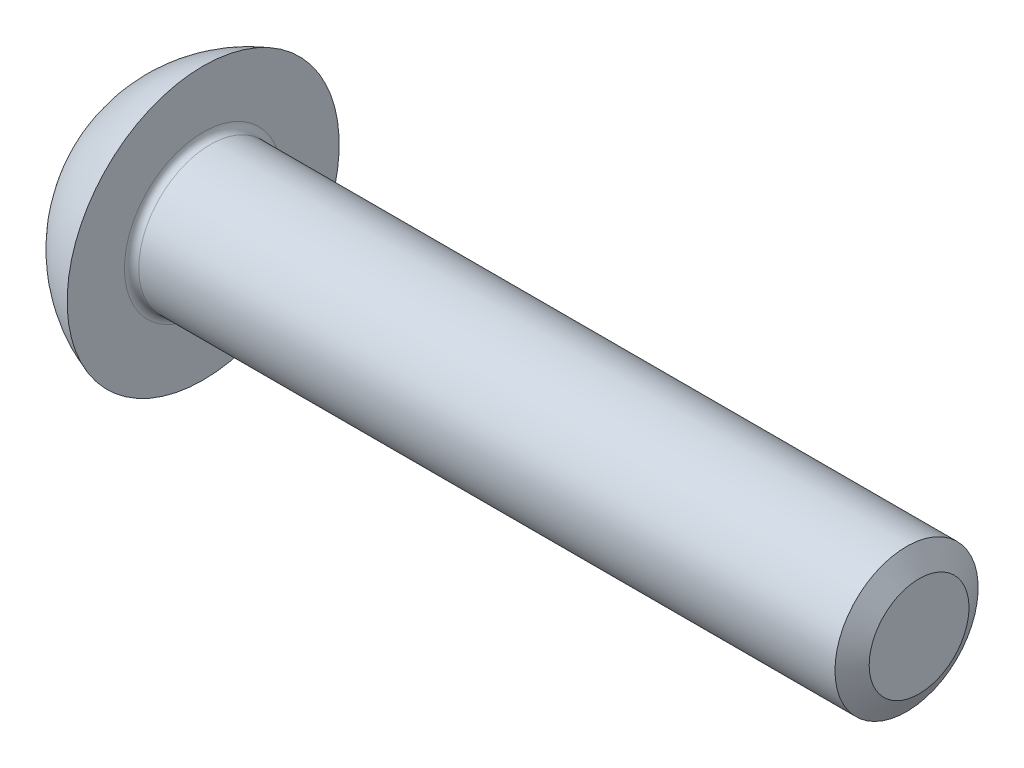
ISO-10303-21;
HEADER;
FILE_DESCRIPTION(('STEP AP214'),'2;1');
FILE_NAME('part.step','',(''),(''),'','','');
FILE_SCHEMA(('AUTOMOTIVE_DESIGN { 1 0 10303 214 1 1 1 1 }'));
ENDSEC;
DATA;
#1=APPLICATION_CONTEXT('core data for automotive mechanical design processes');
#2=APPLICATION_PROTOCOL_DEFINITION('international standard','automotive_design',2000,#1);
#3=PRODUCT_CONTEXT('',#1,'mechanical');
#4=PRODUCT('Part','Part','',(#3));
#5=PRODUCT_RELATED_PRODUCT_CATEGORY('part','',(#4));
#6=PRODUCT_DEFINITION_FORMATION('','',#4);
#7=PRODUCT_DEFINITION_CONTEXT('part definition',#1,'design');
#8=PRODUCT_DEFINITION('design','',#6,#7);
#9=PRODUCT_DEFINITION_SHAPE('','',#8);
#10=(LENGTH_UNIT() NAMED_UNIT(*) SI_UNIT(.MILLI.,.METRE.));
#11=(NAMED_UNIT(*) PLANE_ANGLE_UNIT() SI_UNIT($,.RADIAN.));
#12=(NAMED_UNIT(*) SI_UNIT($,.STERADIAN.) SOLID_ANGLE_UNIT());
#13=UNCERTAINTY_MEASURE_WITH_UNIT(LENGTH_MEASURE(1.E-05),#10,'distance_accuracy_value','');
#14=(GEOMETRIC_REPRESENTATION_CONTEXT(3) GLOBAL_UNCERTAINTY_ASSIGNED_CONTEXT((#13)) GLOBAL_UNIT_ASSIGNED_CONTEXT((#10,
#11,#12)) REPRESENTATION_CONTEXT('',''));
#15=CARTESIAN_POINT('',(0.,0.,0.));
#16=DIRECTION('',(0.,0.,1.));
#17=DIRECTION('',(1.,0.,0.));
#18=AXIS2_PLACEMENT_3D('',#15,#16,#17);
#19=CARTESIAN_POINT('',(-22.2,0.,0.));
#20=DIRECTION('',(-1.,0.,0.));
#21=DIRECTION('',(0.,0.,1.));
#22=AXIS2_PLACEMENT_3D('',#19,#20,#21);
#23=CYLINDRICAL_SURFACE('',#22,2.);
#24=CARTESIAN_POINT('',(-19.8,0.,0.));
#25=DIRECTION('',(-1.,0.,0.));
#26=DIRECTION('',(0.,0.,1.));
#27=AXIS2_PLACEMENT_3D('',#24,#25,#26);
#28=CIRCLE('',#27,2.);
#29=CARTESIAN_POINT('',(-19.8,0.,2.));
#30=VERTEX_POINT('',#29);
#31=EDGE_CURVE('E261',#30,#30,#28,.T.);
#32=ORIENTED_EDGE('',*,*,#31,.F.);
#33=EDGE_LOOP('',(#32));
#34=FACE_BOUND('',#33,.T.);
#35=CARTESIAN_POINT('',(-0.35,0.,0.));
#36=DIRECTION('',(-1.,0.,0.));
#37=DIRECTION('',(0.,0.,1.));
#38=AXIS2_PLACEMENT_3D('',#35,#36,#37);
#39=CIRCLE('',#38,2.);
#40=CARTESIAN_POINT('',(-0.35,0.,2.));
#41=VERTEX_POINT('',#40);
#42=EDGE_CURVE('E406',#41,#41,#39,.T.);
#43=ORIENTED_EDGE('',*,*,#42,.T.);
#44=EDGE_LOOP('',(#43));
#45=FACE_BOUND('',#44,.T.);
#46=ADVANCED_FACE('F40',(#34,#45),#23,.T.);
#47=CARTESIAN_POINT('',(-22.2,0.,0.));
#48=DIRECTION('',(1.,0.,0.));
#49=DIRECTION('',(0.,0.,-1.));
#50=AXIS2_PLACEMENT_3D('',#47,#48,#49);
#51=PLANE('',#50);
#52=CARTESIAN_POINT('',(-22.2,0.,0.));
#53=DIRECTION('',(-1.,0.,0.));
#54=DIRECTION('',(0.,0.,1.));
#55=AXIS2_PLACEMENT_3D('',#52,#53,#54);
#56=CIRCLE('',#55,2.);
#57=CARTESIAN_POINT('',(-22.2,2.,0.));
#58=VERTEX_POINT('',#57);
#59=EDGE_CURVE('E253',#58,#58,#56,.T.);
#60=ORIENTED_EDGE('',*,*,#59,.T.);
#61=EDGE_LOOP('',(#60));
#62=FACE_BOUND('',#61,.T.);
#63=CARTESIAN_POINT('',(-22.2,0.,0.));
#64=DIRECTION('',(1.,0.,0.));
#65=DIRECTION('',(0.,0.,-1.));
#66=AXIS2_PLACEMENT_3D('',#63,#64,#65);
#67=CIRCLE('',#66,1.44337567297406);
#68=CARTESIAN_POINT('',(-22.2,-0.721687836487032,-1.25));
#69=VERTEX_POINT('',#68);
#70=CARTESIAN_POINT('',(-22.2,-1.44337567297406,0.));
#71=VERTEX_POINT('',#70);
#72=EDGE_CURVE('E11',#69,#71,#67,.F.);
#73=ORIENTED_EDGE('',*,*,#72,.F.);
#74=CARTESIAN_POINT('',(-22.2,0.721687836487032,-1.25));
#75=VERTEX_POINT('',#74);
#76=EDGE_CURVE('E44',#75,#69,#67,.F.);
#77=ORIENTED_EDGE('',*,*,#76,.F.);
#78=CARTESIAN_POINT('',(-22.2,1.44337567297406,0.));
#79=VERTEX_POINT('',#78);
#80=EDGE_CURVE('E113',#79,#75,#67,.F.);
#81=ORIENTED_EDGE('',*,*,#80,.F.);
#82=CARTESIAN_POINT('',(-22.2,0.721687836487032,1.25));
#83=VERTEX_POINT('',#82);
#84=EDGE_CURVE('E326',#83,#79,#67,.F.);
#85=ORIENTED_EDGE('',*,*,#84,.F.);
#86=CARTESIAN_POINT('',(-22.2,-0.72168783648703,1.25));
#87=VERTEX_POINT('',#86);
#88=EDGE_CURVE('E49',#87,#83,#67,.F.);
#89=ORIENTED_EDGE('',*,*,#88,.F.);
#90=CARTESIAN_POINT('',(-22.2,0.,0.));
#91=DIRECTION('',(-1.,0.,0.));
#92=DIRECTION('',(0.,-1.,0.));
#93=AXIS2_PLACEMENT_3D('',#90,#91,#92);
#94=CIRCLE('',#93,1.44337567297406);
#95=EDGE_CURVE('E116',#71,#87,#94,.T.);
#96=ORIENTED_EDGE('',*,*,#95,.F.);
#97=EDGE_LOOP('',(#73,#77,#81,#85,#89,#96));
#98=FACE_BOUND('',#97,.T.);
#99=ADVANCED_FACE('F42',(#62,#98),#51,.F.);
#100=CARTESIAN_POINT('',(-18.7272727272727,0.,0.));
#101=DIRECTION('',(-1.,0.,0.));
#102=DIRECTION('',(0.,1.,0.));
#103=AXIS2_PLACEMENT_3D('',#100,#101,#102);
#104=SPHERICAL_SURFACE('',#103,4.00747235932374);
#105=CARTESIAN_POINT('',(-20.,0.,0.));
#106=DIRECTION('',(-1.,0.,0.));
#107=DIRECTION('',(0.,0.,1.));
#108=AXIS2_PLACEMENT_3D('',#105,#106,#107);
#109=CIRCLE('',#108,3.8);
#110=CARTESIAN_POINT('',(-20.,3.8,0.));
#111=VERTEX_POINT('',#110);
#112=EDGE_CURVE('E256',#111,#111,#109,.T.);
#113=CARTESIAN_POINT('',(-22.2,2.,0.));
#114=CARTESIAN_POINT('',(-22.1848940441993,2.0262295590073,0.));
#115=CARTESIAN_POINT('',(-22.1694908144314,2.05228791024858,0.));
#116=CARTESIAN_POINT('',(-22.1380979525594,2.10404896261472,0.));
#117=CARTESIAN_POINT('',(-22.1221083204554,2.12975166373959,0.));
#118=CARTESIAN_POINT('',(-22.0895507995097,2.18078818128854,0.));
#119=CARTESIAN_POINT('',(-22.072982910668,2.20612199771262,0.));
#120=CARTESIAN_POINT('',(-22.0392773993975,2.25640774959029,0.));
#121=CARTESIAN_POINT('',(-22.0221397769687,2.28135968504386,0.));
#122=CARTESIAN_POINT('',(-21.9873035925655,2.33086886166223,0.));
#123=CARTESIAN_POINT('',(-21.9696050305911,2.35542610282703,0.));
#124=CARTESIAN_POINT('',(-21.9336560549214,2.40413328370188,0.));
#125=CARTESIAN_POINT('',(-21.9154056412261,2.42828322341193,0.));
#126=CARTESIAN_POINT('',(-21.8783623317131,2.47616340238235,0.));
#127=CARTESIAN_POINT('',(-21.8595694358953,2.49989364164271,0.));
#128=CARTESIAN_POINT('',(-21.8214508106667,2.54692223644896,0.));
#129=CARTESIAN_POINT('',(-21.8021250812559,2.57022059199485,0.));
#130=CARTESIAN_POINT('',(-21.7629507108208,2.61637345777279,0.));
#131=CARTESIAN_POINT('',(-21.7431020697966,2.63922796800484,0.));
#132=CARTESIAN_POINT('',(-21.7028920666117,2.68448140944799,0.));
#133=CARTESIAN_POINT('',(-21.682530704451,2.70688034065911,0.));
#134=CARTESIAN_POINT('',(-21.6413057126977,2.75121112424682,0.));
#135=CARTESIAN_POINT('',(-21.6204420831052,2.77314297662341,0.));
#136=CARTESIAN_POINT('',(-21.5782232680636,2.81652834253228,0.));
#137=CARTESIAN_POINT('',(-21.5568680826145,2.83798185606455,0.));
#138=CARTESIAN_POINT('',(-21.5136771198039,2.88039952985806,0.));
#139=CARTESIAN_POINT('',(-21.4918413424423,2.90136369011931,0.));
#140=CARTESIAN_POINT('',(-21.447700406491,2.94279189418253,0.));
#141=CARTESIAN_POINT('',(-21.4253952479013,2.96325593798452,0.));
#142=CARTESIAN_POINT('',(-21.3803270011625,3.00367340270524,0.));
#143=CARTESIAN_POINT('',(-21.3575639130134,3.02362682362399,0.));
#144=CARTESIAN_POINT('',(-21.3115914939299,3.06301279831263,0.));
#145=CARTESIAN_POINT('',(-21.2883821629955,3.08244535208254,0.));
#146=CARTESIAN_POINT('',(-21.2415291742204,3.12077961562579,0.));
#147=CARTESIAN_POINT('',(-21.2178855163797,3.13968132539914,0.));
#148=CARTESIAN_POINT('',(-21.1701760126585,3.17694419664163,0.));
#149=CARTESIAN_POINT('',(-21.1461101667779,3.19530535811077,0.));
#150=CARTESIAN_POINT('',(-21.0975686425984,3.23147770595957,0.));
#151=CARTESIAN_POINT('',(-21.0730929642995,3.24928889233922,0.));
#152=CARTESIAN_POINT('',(-21.0237443413165,3.2843521455859,0.));
#153=CARTESIAN_POINT('',(-20.9988713966324,3.30160421245294,0.));
#154=CARTESIAN_POINT('',(-20.9487410108723,3.3355403693082,0.));
#155=CARTESIAN_POINT('',(-20.9234835697963,3.35222445929642,0.));
#156=CARTESIAN_POINT('',(-20.8725971586496,3.38501609663248,0.));
#157=CARTESIAN_POINT('',(-20.846968188579,3.40112364398032,0.));
#158=CARTESIAN_POINT('',(-20.7953518775865,3.43275392627554,0.));
#159=CARTESIAN_POINT('',(-20.7693645366645,3.44827666122294,0.));
#160=CARTESIAN_POINT('',(-20.7170448261044,3.47872934920754,0.));
#161=CARTESIAN_POINT('',(-20.6907124564662,3.49365930224475,0.));
#162=CARTESIAN_POINT('',(-20.6377162077463,3.52291876123,0.));
#163=CARTESIAN_POINT('',(-20.6110523286645,3.53724826717803,0.));
#164=CARTESIAN_POINT('',(-20.5574067505418,3.56529947511373,0.));
#165=CARTESIAN_POINT('',(-20.5304250515009,3.57902117710138,0.));
#166=CARTESIAN_POINT('',(-20.4761576860719,3.60584973217452,0.));
#167=CARTESIAN_POINT('',(-20.4488720196837,3.61895658526,0.));
#168=CARTESIAN_POINT('',(-20.3940107283966,3.6445487137135,0.));
#169=CARTESIAN_POINT('',(-20.3664351034975,3.65703398908152,0.));
#170=CARTESIAN_POINT('',(-20.3110080522769,3.6813765507008,0.));
#171=CARTESIAN_POINT('',(-20.2831566259553,3.69323383695206,0.));
#172=CARTESIAN_POINT('',(-20.2271922728732,3.71631433772655,0.));
#173=CARTESIAN_POINT('',(-20.1990793461126,3.72753755224977,0.));
#174=CARTESIAN_POINT('',(-20.1426064188229,3.74934412871163,0.));
#175=CARTESIAN_POINT('',(-20.1142464182937,3.75992749065027,0.));
#176=CARTESIAN_POINT('',(-20.0572939289701,3.78044899835327,0.));
#177=CARTESIAN_POINT('',(-20.0287014401756,3.79038714411763,0.));
#178=CARTESIAN_POINT('',(-20.,3.8,0.));
#179=B_SPLINE_CURVE_WITH_KNOTS('',3,(#113,#114,#115,#116,#117,#118,#119,#120,#121,#122,#123,
#124,#125,#126,#127,#128,#129,#130,#131,#132,#133,#134,#135,#136,#137,#138,#139,#140,#141,#142,
#143,#144,#145,#146,#147,#148,#149,#150,#151,#152,#153,#154,#155,#156,#157,#158,#159,#160,#161,
#162,#163,#164,#165,#166,#167,#168,#169,#170,#171,#172,#173,#174,#175,#176,#177,#178),
.UNSPECIFIED.,.F.,.F.,(4,2,2,2,2,2,2,2,2,2,2,2,2,2,2,2,2,2,2,2,2,2,2,2,2,2,2,2,2,2,2,2,4),(0.,
0.0908034330338798,0.18160686606776,0.272410299101639,0.363213732135519,0.454017165169397,
0.544820598203278,0.635624031237158,0.726427464271037,0.817230897304917,0.908034330338796,
0.998837763372674,1.08964119640656,1.18044462944044,1.27124806247431,1.36205149550819,
1.45285492854207,1.54365836157595,1.63446179460983,1.72526522764371,1.81606866067759,
1.90687209371147,1.99767552674535,2.08847895977923,2.17928239281311,2.27008582584699,
2.36088925888087,2.45169269191475,2.54249612494863,2.63329955798251,2.72410299101638,
2.81490642405026,2.90570985708415),.UNSPECIFIED.);
#180=EDGE_CURVE('BSEAM242',#58,#111,#179,.T.);
#181=ORIENTED_EDGE('',*,*,#59,.F.);
#182=ORIENTED_EDGE('',*,*,#112,.T.);
#183=ORIENTED_EDGE('',*,*,#180,.T.);
#184=ORIENTED_EDGE('',*,*,#180,.F.);
#185=EDGE_LOOP('',(#181,#183,#182,#184));
#186=FACE_BOUND('',#185,.T.);
#187=ADVANCED_FACE('F242',(#186),#104,.T.);
#188=CARTESIAN_POINT('',(-20.,2.2,0.));
#189=DIRECTION('',(-1.,0.,0.));
#190=DIRECTION('',(0.,0.,1.));
#191=AXIS2_PLACEMENT_3D('',#188,#189,#190);
#192=PLANE('',#191);
#193=ORIENTED_EDGE('',*,*,#112,.F.);
#194=EDGE_LOOP('',(#193));
#195=FACE_BOUND('',#194,.T.);
#196=CARTESIAN_POINT('',(-20.,0.,0.));
#197=DIRECTION('',(-1.,0.,0.));
#198=DIRECTION('',(0.,0.,1.));
#199=AXIS2_PLACEMENT_3D('',#196,#197,#198);
#200=CIRCLE('',#199,2.2);
#201=CARTESIAN_POINT('',(-20.,0.,2.2));
#202=VERTEX_POINT('',#201);
#203=EDGE_CURVE('E257',#202,#202,#200,.T.);
#204=ORIENTED_EDGE('',*,*,#203,.T.);
#205=EDGE_LOOP('',(#204));
#206=FACE_BOUND('',#205,.T.);
#207=ADVANCED_FACE('F239',(#195,#206),#192,.F.);
#208=CARTESIAN_POINT('',(-19.8,0.,0.));
#209=DIRECTION('',(-1.,0.,0.));
#210=DIRECTION('',(0.,0.,1.));
#211=AXIS2_PLACEMENT_3D('',#208,#209,#210);
#212=TOROIDAL_SURFACE('',#211,2.2,0.199999999999998);
#213=ORIENTED_EDGE('',*,*,#203,.F.);
#214=EDGE_LOOP('',(#213));
#215=FACE_BOUND('',#214,.T.);
#216=ORIENTED_EDGE('',*,*,#31,.T.);
#217=EDGE_LOOP('',(#216));
#218=FACE_BOUND('',#217,.T.);
#219=ADVANCED_FACE('F236',(#215,#218),#212,.F.);
#220=CARTESIAN_POINT('',(-21.83,0.,0.));
#221=DIRECTION('',(-1.,0.,0.));
#222=DIRECTION('',(0.,-1.,0.));
#223=AXIS2_PLACEMENT_3D('',#220,#221,#222);
#224=CONICAL_SURFACE('',#223,0.,1.31985626102756);
#225=CARTESIAN_POINT('',(-22.4099346759325,-1.88564456107599,-1.25));
#226=CARTESIAN_POINT('',(-22.3978717207476,-1.82917708741649,-1.25));
#227=CARTESIAN_POINT('',(-22.3859628503841,-1.77267667257229,-1.25));
#228=CARTESIAN_POINT('',(-22.3625309817374,-1.6595935375387,-1.25));
#229=CARTESIAN_POINT('',(-22.3510079994509,-1.60301081403846,-1.25));
#230=CARTESIAN_POINT('',(-22.3171150455956,-1.43301680255399,-1.25));
#231=CARTESIAN_POINT('',(-22.2954436732229,-1.31946408423816,-1.25));
#232=CARTESIAN_POINT('',(-22.2550957638519,-1.09274070822473,-1.25));
#233=CARTESIAN_POINT('',(-22.2363969731626,-0.979574090908787,-1.25));
#234=CARTESIAN_POINT('',(-22.2032623365578,-0.752620098767594,-1.25));
#235=CARTESIAN_POINT('',(-22.188825705465,-0.638832842215424,-1.25));
#236=CARTESIAN_POINT('',(-22.1660896767959,-0.409425109570646,-1.25));
#237=CARTESIAN_POINT('',(-22.1578544497063,-0.293797778292056,-1.25));
#238=CARTESIAN_POINT('',(-22.1515679025376,-0.120164512871692,-1.25));
#239=CARTESIAN_POINT('',(-22.150483164521,-0.0622627928697112,-1.25));
#240=CARTESIAN_POINT('',(-22.1503795328621,0.053542564363427,-1.25));
#241=CARTESIAN_POINT('',(-22.1513606413601,0.111446201596509,-1.25));
#242=CARTESIAN_POINT('',(-22.1573598650309,0.285474295611225,-1.25));
#243=CARTESIAN_POINT('',(-22.1654487463646,0.401498867331893,-1.25));
#244=CARTESIAN_POINT('',(-22.1881044285101,0.632939913567418,-1.25));
#245=CARTESIAN_POINT('',(-22.2026754362751,0.74835594383121,-1.25));
#246=CARTESIAN_POINT('',(-22.2365518645336,0.98087854833956,-1.25));
#247=CARTESIAN_POINT('',(-22.2559479393881,1.09797147869704,-1.25));
#248=CARTESIAN_POINT('',(-22.297694705209,1.33163516353435,-1.25));
#249=CARTESIAN_POINT('',(-22.3200458280349,1.44820583911091,-1.25));
#250=CARTESIAN_POINT('',(-22.3666691464558,1.68099121637415,-1.25));
#251=CARTESIAN_POINT('',(-22.3909418646374,1.7972058122361,-1.25));
#252=CARTESIAN_POINT('',(-22.4407644332086,2.02936144854685,-1.25));
#253=CARTESIAN_POINT('',(-22.4663143094331,2.14530248341221,-1.25));
#254=CARTESIAN_POINT('',(-22.518006571917,2.37571314631909,-1.25));
#255=CARTESIAN_POINT('',(-22.5441393559518,2.49018493743662,-1.25));
#256=CARTESIAN_POINT('',(-22.5970181249123,2.71898894131965,-1.25));
#257=CARTESIAN_POINT('',(-22.6237641225282,2.83332115114489,-1.25));
#258=CARTESIAN_POINT('',(-22.6776683130688,3.06173187864781,-1.25));
#259=CARTESIAN_POINT('',(-22.7048259274931,3.17581053313172,-1.25));
#260=CARTESIAN_POINT('',(-22.7594820608418,3.40388218743046,-1.25));
#261=CARTESIAN_POINT('',(-22.7869805683896,3.51787518996982,-1.25));
#262=CARTESIAN_POINT('',(-22.8145979060137,3.63183906574752,-1.25));
#263=B_SPLINE_CURVE_WITH_KNOTS('',3,(#225,#226,#227,#228,#229,#230,#231,#232,#233,#234,#235,
#236,#237,#238,#239,#240,#241,#242,#243,#244,#245,#246,#247,#248,#249,#250,#251,#252,#253,#254,
#255,#256,#257,#258,#259,#260,#261,#262),.UNSPECIFIED.,.F.,.F.,(4,2,2,2,2,2,2,2,2,2,2,2,2,2,2,2,
2,2,4),(0.,0.173224298995285,0.346455770019721,0.693239171189209,1.03728991141695,
1.38127723083866,1.72877689604066,1.90247833739643,2.07617995870962,2.42483219738434,
2.77371104508348,3.12971850144864,3.48577804345033,3.84193475233926,4.19809866864176,
4.55034691705481,4.90260246171337,5.25440194240086,5.60618971383705),.UNSPECIFIED.);
#264=EDGE_CURVE('E104',#69,#75,#263,.T.);
#265=ORIENTED_EDGE('',*,*,#264,.T.);
#266=ORIENTED_EDGE('',*,*,#76,.T.);
#267=EDGE_LOOP('',(#265,#266));
#268=FACE_BOUND('',#267,.T.);
#269=ADVANCED_FACE('F108',(#268),#224,.F.);
#270=CARTESIAN_POINT('',(-22.2000296035517,0.721572366433194,-1.2502));
#271=CARTESIAN_POINT('',(-22.1923376245114,0.751560236122211,-1.19825948608787));
#272=CARTESIAN_POINT('',(-22.1853558988612,0.781597955311093,-1.14623263030924));
#273=CARTESIAN_POINT('',(-22.1730912390252,0.841770545746215,-1.04201064645257));
#274=CARTESIAN_POINT('',(-22.1678089341386,0.871905448817342,-0.989815463252219));
#275=CARTESIAN_POINT('',(-22.1592477971586,0.932104975245319,-0.885546824887377));
#276=CARTESIAN_POINT('',(-22.1559596086559,0.96216925702196,-0.833473961357168));
#277=CARTESIAN_POINT('',(-22.1515506008694,1.0223329488635,-0.729267390316703));
#278=CARTESIAN_POINT('',(-22.1504293994002,1.05243235179702,-0.677133695158352));
#279=CARTESIAN_POINT('',(-22.1504293994002,1.11263115766407,-0.572866304841649));
#280=CARTESIAN_POINT('',(-22.1515506008694,1.1427305605976,-0.520732609683297));
#281=CARTESIAN_POINT('',(-22.1559596086559,1.20289425243914,-0.416526038642832));
#282=CARTESIAN_POINT('',(-22.1592477971586,1.23295853421578,-0.364453175112624));
#283=CARTESIAN_POINT('',(-22.1678089341386,1.29315806064375,-0.260184536747781));
#284=CARTESIAN_POINT('',(-22.1730912390252,1.32329296371488,-0.207989353547427));
#285=CARTESIAN_POINT('',(-22.1853558988612,1.38346555415,-0.103767369690763));
#286=CARTESIAN_POINT('',(-22.1923376245114,1.41350327333889,-0.0517405139121318));
#287=CARTESIAN_POINT('',(-22.2000296035517,1.4434911430279,0.000199999999999577));
#288=B_SPLINE_CURVE_WITH_KNOTS('',3,(#270,#271,#272,#273,#274,#275,#276,#277,#278,#279,#280,
#281,#282,#283,#284,#285,#286,#287),.UNSPECIFIED.,.F.,.F.,(4,2,2,2,2,2,2,2,4),(0.,
0.181409592460797,0.362886284169927,0.543504761741732,0.724091381228727,0.904678000715721,
1.08529647828753,1.26677316999666,1.44818276245745),.UNSPECIFIED.);
#289=EDGE_CURVE('E132',#75,#79,#288,.T.);
#290=ORIENTED_EDGE('',*,*,#289,.T.);
#291=ORIENTED_EDGE('',*,*,#80,.T.);
#292=EDGE_LOOP('',(#290,#291));
#293=FACE_BOUND('',#292,.T.);
#294=ADVANCED_FACE('F160',(#293),#224,.F.);
#295=CARTESIAN_POINT('',(-22.2000296035517,1.4434911430279,-0.000200000000000031));
#296=CARTESIAN_POINT('',(-22.1923376245114,1.41350327333889,0.0517405139121313));
#297=CARTESIAN_POINT('',(-22.1853558988612,1.38346555415,0.103767369690762));
#298=CARTESIAN_POINT('',(-22.1730912390252,1.32329296371488,0.207989353547427));
#299=CARTESIAN_POINT('',(-22.1678089341386,1.29315806064375,0.260184536747781));
#300=CARTESIAN_POINT('',(-22.1592477971586,1.23295853421578,0.364453175112623));
#301=CARTESIAN_POINT('',(-22.1559596086559,1.20289425243914,0.416526038642832));
#302=CARTESIAN_POINT('',(-22.1515506008694,1.1427305605976,0.520732609683297));
#303=CARTESIAN_POINT('',(-22.1504293994002,1.11263115766407,0.572866304841648));
#304=CARTESIAN_POINT('',(-22.1504293994002,1.05243235179702,0.677133695158351));
#305=CARTESIAN_POINT('',(-22.1515506008694,1.0223329488635,0.729267390316703));
#306=CARTESIAN_POINT('',(-22.1559596086559,0.96216925702196,0.833473961357168));
#307=CARTESIAN_POINT('',(-22.1592477971586,0.93210497524532,0.885546824887376));
#308=CARTESIAN_POINT('',(-22.1678089341386,0.871905448817342,0.989815463252218));
#309=CARTESIAN_POINT('',(-22.1730912390252,0.841770545746216,1.04201064645257));
#310=CARTESIAN_POINT('',(-22.1853558988612,0.781597955311094,1.14623263030924));
#311=CARTESIAN_POINT('',(-22.1923376245114,0.751560236122211,1.19825948608787));
#312=CARTESIAN_POINT('',(-22.2000296035517,0.721572366433195,1.2502));
#313=B_SPLINE_CURVE_WITH_KNOTS('',3,(#295,#296,#297,#298,#299,#300,#301,#302,#303,#304,#305,
#306,#307,#308,#309,#310,#311,#312),.UNSPECIFIED.,.F.,.F.,(4,2,2,2,2,2,2,2,4),(0.,
0.181409592460797,0.362886284169927,0.543504761741732,0.724091381228726,0.904678000715721,
1.08529647828753,1.26677316999665,1.44818276245745),.UNSPECIFIED.);
#314=EDGE_CURVE('E182',#79,#83,#313,.T.);
#315=ORIENTED_EDGE('',*,*,#314,.T.);
#316=ORIENTED_EDGE('',*,*,#84,.T.);
#317=EDGE_LOOP('',(#315,#316));
#318=FACE_BOUND('',#317,.T.);
#319=ADVANCED_FACE('F154',(#318),#224,.F.);
#320=CARTESIAN_POINT('',(-22.4099346759325,-1.88564456107599,1.25));
#321=CARTESIAN_POINT('',(-22.3978717207476,-1.82917708741649,1.25));
#322=CARTESIAN_POINT('',(-22.3859628503841,-1.7726766725723,1.25));
#323=CARTESIAN_POINT('',(-22.3625309817374,-1.6595935375387,1.25));
#324=CARTESIAN_POINT('',(-22.3510079994509,-1.60301081403846,1.25));
#325=CARTESIAN_POINT('',(-22.3171150455956,-1.43301680255399,1.25));
#326=CARTESIAN_POINT('',(-22.2954436732229,-1.31946408423816,1.25));
#327=CARTESIAN_POINT('',(-22.2550957638519,-1.09274070822473,1.25));
#328=CARTESIAN_POINT('',(-22.2363969731626,-0.979574090908786,1.25));
#329=CARTESIAN_POINT('',(-22.2032623365578,-0.752620098767594,1.25));
#330=CARTESIAN_POINT('',(-22.188825705465,-0.638832842215423,1.25));
#331=CARTESIAN_POINT('',(-22.1660896767959,-0.409425109570645,1.25));
#332=CARTESIAN_POINT('',(-22.1578544497063,-0.293797778292055,1.25));
#333=CARTESIAN_POINT('',(-22.1515679025376,-0.120164512871691,1.25));
#334=CARTESIAN_POINT('',(-22.150483164521,-0.0622627928697106,1.25));
#335=CARTESIAN_POINT('',(-22.1503795328621,0.0535425643634276,1.25));
#336=CARTESIAN_POINT('',(-22.1513606413601,0.111446201596509,1.25));
#337=CARTESIAN_POINT('',(-22.1573598650309,0.285474295611226,1.25));
#338=CARTESIAN_POINT('',(-22.1654487463646,0.401498867331894,1.25));
#339=CARTESIAN_POINT('',(-22.1881044285101,0.632939913567418,1.25));
#340=CARTESIAN_POINT('',(-22.2026754362751,0.74835594383121,1.25));
#341=CARTESIAN_POINT('',(-22.2365518645336,0.98087854833956,1.25));
#342=CARTESIAN_POINT('',(-22.2559479393881,1.09797147869704,1.25));
#343=CARTESIAN_POINT('',(-22.297694705209,1.33163516353435,1.25));
#344=CARTESIAN_POINT('',(-22.3200458280349,1.44820583911091,1.25));
#345=CARTESIAN_POINT('',(-22.3666691464558,1.68099121637415,1.25));
#346=CARTESIAN_POINT('',(-22.3909418646374,1.7972058122361,1.25));
#347=CARTESIAN_POINT('',(-22.4407644332086,2.02936144854685,1.25));
#348=CARTESIAN_POINT('',(-22.4663143094331,2.1453024834122,1.25));
#349=CARTESIAN_POINT('',(-22.518006571917,2.37571314631908,1.25));
#350=CARTESIAN_POINT('',(-22.5441393559518,2.49018493743662,1.25));
#351=CARTESIAN_POINT('',(-22.5970181249123,2.71898894131965,1.25));
#352=CARTESIAN_POINT('',(-22.6237641225282,2.83332115114489,1.25));
#353=CARTESIAN_POINT('',(-22.6776683130688,3.06173187864781,1.25));
#354=CARTESIAN_POINT('',(-22.7048259274931,3.17581053313172,1.25));
#355=CARTESIAN_POINT('',(-22.7594820608418,3.40388218743046,1.25));
#356=CARTESIAN_POINT('',(-22.7869805683896,3.51787518996982,1.25));
#357=CARTESIAN_POINT('',(-22.8145979060137,3.63183906574752,1.25));
#358=B_SPLINE_CURVE_WITH_KNOTS('',3,(#320,#321,#322,#323,#324,#325,#326,#327,#328,#329,#330,
#331,#332,#333,#334,#335,#336,#337,#338,#339,#340,#341,#342,#343,#344,#345,#346,#347,#348,#349,
#350,#351,#352,#353,#354,#355,#356,#357),.UNSPECIFIED.,.F.,.F.,(4,2,2,2,2,2,2,2,2,2,2,2,2,2,2,2,
2,2,4),(0.,0.173224298995285,0.346455770019721,0.693239171189209,1.03728991141695,
1.38127723083866,1.72877689604066,1.90247833739643,2.07617995870962,2.42483219738435,
2.77371104508348,3.12971850144864,3.48577804345033,3.84193475233926,4.19809866864176,
4.55034691705481,4.90260246171336,5.25440194240086,5.60618971383705),.UNSPECIFIED.);
#359=EDGE_CURVE('E61',#83,#87,#358,.F.);
#360=ORIENTED_EDGE('',*,*,#359,.T.);
#361=ORIENTED_EDGE('',*,*,#88,.T.);
#362=EDGE_LOOP('',(#360,#361));
#363=FACE_BOUND('',#362,.T.);
#364=ADVANCED_FACE('F159',(#363),#224,.F.);
#365=CARTESIAN_POINT('',(-22.2000296035517,-0.721572366433195,1.2502));
#366=CARTESIAN_POINT('',(-22.1923376245114,-0.751560236122212,1.19825948608787));
#367=CARTESIAN_POINT('',(-22.1853558988612,-0.781597955311094,1.14623263030924));
#368=CARTESIAN_POINT('',(-22.1730912390252,-0.841770545746216,1.04201064645257));
#369=CARTESIAN_POINT('',(-22.1678089341386,-0.871905448817343,0.989815463252219));
#370=CARTESIAN_POINT('',(-22.1592477971586,-0.93210497524532,0.885546824887376));
#371=CARTESIAN_POINT('',(-22.1559596086559,-0.962169257021961,0.833473961357168));
#372=CARTESIAN_POINT('',(-22.1515506008694,-1.0223329488635,0.729267390316703));
#373=CARTESIAN_POINT('',(-22.1504293994002,-1.05243235179702,0.677133695158351));
#374=CARTESIAN_POINT('',(-22.1504293994002,-1.11263115766407,0.572866304841648));
#375=CARTESIAN_POINT('',(-22.1515506008694,-1.1427305605976,0.520732609683297));
#376=CARTESIAN_POINT('',(-22.1559596086559,-1.20289425243914,0.416526038642831));
#377=CARTESIAN_POINT('',(-22.1592477971586,-1.23295853421578,0.364453175112623));
#378=CARTESIAN_POINT('',(-22.1678089341386,-1.29315806064376,0.260184536747781));
#379=CARTESIAN_POINT('',(-22.1730912390252,-1.32329296371488,0.207989353547427));
#380=CARTESIAN_POINT('',(-22.1853558988612,-1.38346555415,0.103767369690762));
#381=CARTESIAN_POINT('',(-22.1923376245114,-1.41350327333889,0.0517405139121309));
#382=CARTESIAN_POINT('',(-22.2000296035517,-1.4434911430279,-0.000200000000000362));
#383=B_SPLINE_CURVE_WITH_KNOTS('',3,(#365,#366,#367,#368,#369,#370,#371,#372,#373,#374,#375,
#376,#377,#378,#379,#380,#381,#382),.UNSPECIFIED.,.F.,.F.,(4,2,2,2,2,2,2,2,4),(0.,
0.181409592460798,0.362886284169927,0.543504761741732,0.724091381228727,0.904678000715721,
1.08529647828753,1.26677316999666,1.44818276245745),.UNSPECIFIED.);
#384=EDGE_CURVE('E55',#87,#71,#383,.T.);
#385=ORIENTED_EDGE('',*,*,#384,.T.);
#386=ORIENTED_EDGE('',*,*,#95,.T.);
#387=EDGE_LOOP('',(#385,#386));
#388=FACE_BOUND('',#387,.T.);
#389=ADVANCED_FACE('F313',(#388),#224,.F.);
#390=CARTESIAN_POINT('',(-22.2000296035517,-1.4434911430279,0.000199999999999629));
#391=CARTESIAN_POINT('',(-22.1923376245114,-1.41350327333889,-0.0517405139121315));
#392=CARTESIAN_POINT('',(-22.1853558988612,-1.38346555415,-0.103767369690762));
#393=CARTESIAN_POINT('',(-22.1730912390252,-1.32329296371488,-0.207989353547427));
#394=CARTESIAN_POINT('',(-22.1678089341386,-1.29315806064376,-0.260184536747781));
#395=CARTESIAN_POINT('',(-22.1592477971586,-1.23295853421578,-0.364453175112624));
#396=CARTESIAN_POINT('',(-22.1559596086559,-1.20289425243914,-0.416526038642832));
#397=CARTESIAN_POINT('',(-22.1515506008694,-1.1427305605976,-0.520732609683297));
#398=CARTESIAN_POINT('',(-22.1504293994002,-1.11263115766407,-0.572866304841649));
#399=CARTESIAN_POINT('',(-22.1504293994002,-1.05243235179702,-0.677133695158352));
#400=CARTESIAN_POINT('',(-22.1515506008694,-1.0223329488635,-0.729267390316704));
#401=CARTESIAN_POINT('',(-22.1559596086559,-0.96216925702196,-0.833473961357169));
#402=CARTESIAN_POINT('',(-22.1592477971586,-0.93210497524532,-0.885546824887377));
#403=CARTESIAN_POINT('',(-22.1678089341386,-0.871905448817342,-0.989815463252219));
#404=CARTESIAN_POINT('',(-22.1730912390252,-0.841770545746216,-1.04201064645257));
#405=CARTESIAN_POINT('',(-22.1853558988612,-0.781597955311094,-1.14623263030924));
#406=CARTESIAN_POINT('',(-22.1923376245114,-0.751560236122211,-1.19825948608787));
#407=CARTESIAN_POINT('',(-22.2000296035517,-0.721572366433195,-1.2502));
#408=B_SPLINE_CURVE_WITH_KNOTS('',3,(#390,#391,#392,#393,#394,#395,#396,#397,#398,#399,#400,
#401,#402,#403,#404,#405,#406,#407),.UNSPECIFIED.,.F.,.F.,(4,2,2,2,2,2,2,2,4),(0.,
0.181409592460797,0.362886284169927,0.543504761741732,0.724091381228727,0.904678000715721,
1.08529647828753,1.26677316999666,1.44818276245745),.UNSPECIFIED.);
#409=EDGE_CURVE('E96',#71,#69,#408,.T.);
#410=ORIENTED_EDGE('',*,*,#409,.T.);
#411=ORIENTED_EDGE('',*,*,#72,.T.);
#412=EDGE_LOOP('',(#410,#411));
#413=FACE_BOUND('',#412,.T.);
#414=ADVANCED_FACE('F98',(#413),#224,.F.);
#415=CARTESIAN_POINT('',(-20.9,0.,0.));
#416=DIRECTION('',(-1.,0.,0.));
#417=DIRECTION('',(0.,0.,1.));
#418=AXIS2_PLACEMENT_3D('',#415,#416,#417);
#419=CONICAL_SURFACE('',#418,1.44337567297406,1.01324881882863);
#420=CARTESIAN_POINT('',(-20.,0.,0.));
#421=VERTEX_POINT('',#420);
#422=VERTEX_LOOP('',#421);
#423=FACE_BOUND('',#422,.T.);
#424=CARTESIAN_POINT('',(-21.3527945795421,-1.77325319370587,1.25));
#425=CARTESIAN_POINT('',(-21.3272313608337,-1.72308054748254,1.25));
#426=CARTESIAN_POINT('',(-21.3019425610441,-1.67276579739611,1.25));
#427=CARTESIAN_POINT('',(-21.2520602884769,-1.57178113050656,1.25));
#428=CARTESIAN_POINT('',(-21.2274669508561,-1.52111114702254,1.25));
#429=CARTESIAN_POINT('',(-21.1789832389279,-1.41905106562435,1.25));
#430=CARTESIAN_POINT('',(-21.1550981267071,-1.36765845463947,1.25));
#431=CARTESIAN_POINT('',(-21.1084115654387,-1.26438731533743,1.25));
#432=CARTESIAN_POINT('',(-21.0856100580289,-1.21250881337054,1.25));
#433=CARTESIAN_POINT('',(-21.0180066296141,-1.05318865262781,1.25));
#434=CARTESIAN_POINT('',(-20.975348048821,-0.944818595736523,1.25));
#435=CARTESIAN_POINT('',(-20.899249765014,-0.725021793662278,1.25));
#436=CARTESIAN_POINT('',(-20.8657864364544,-0.613603706258271,1.25));
#437=CARTESIAN_POINT('',(-20.8255224000706,-0.439829475428557,1.25));
#438=CARTESIAN_POINT('',(-20.8135539759356,-0.378686784718629,1.25));
#439=CARTESIAN_POINT('',(-20.7946834115852,-0.255611326700577,1.25));
#440=CARTESIAN_POINT('',(-20.7877804723348,-0.19367868556883,1.25));
#441=CARTESIAN_POINT('',(-20.7797277447971,-0.0702459018996857,1.25));
#442=CARTESIAN_POINT('',(-20.7785036595021,-0.00875074655362725,1.25));
#443=CARTESIAN_POINT('',(-20.7817252928589,0.114091468273714,1.25));
#444=CARTESIAN_POINT('',(-20.7861717520863,0.175438507362529,1.25));
#445=CARTESIAN_POINT('',(-20.802790821166,0.318793774562431,1.25));
#446=CARTESIAN_POINT('',(-20.8171162097553,0.400550507800212,1.25));
#447=CARTESIAN_POINT('',(-20.8533604743273,0.562357759535311,1.25));
#448=CARTESIAN_POINT('',(-20.8752859853004,0.642406722094854,1.25));
#449=CARTESIAN_POINT('',(-20.9252263796582,0.802612605575799,1.25));
#450=CARTESIAN_POINT('',(-20.9533725953862,0.882727610112281,1.25));
#451=CARTESIAN_POINT('',(-21.0137044102596,1.04136692759758,1.25));
#452=CARTESIAN_POINT('',(-21.0458888175979,1.11989170196819,1.25));
#453=CARTESIAN_POINT('',(-21.1085113010088,1.26504456834479,1.25));
#454=CARTESIAN_POINT('',(-21.1385863298607,1.33183108575291,1.25));
#455=CARTESIAN_POINT('',(-21.2003370421044,1.46466259424516,1.25));
#456=CARTESIAN_POINT('',(-21.2320128472902,1.53070752843773,1.25));
#457=CARTESIAN_POINT('',(-21.3288612944515,1.72800114412657,1.25));
#458=CARTESIAN_POINT('',(-21.3958346146514,1.85836304165699,1.25));
#459=CARTESIAN_POINT('',(-21.5327729293065,2.11775589592147,1.25));
#460=CARTESIAN_POINT('',(-21.6027425964556,2.24678435317969,1.25));
#461=CARTESIAN_POINT('',(-21.7445495255551,2.50377456749809,1.25));
#462=CARTESIAN_POINT('',(-21.8163864088467,2.63173653399053,1.25));
#463=CARTESIAN_POINT('',(-21.9535702802704,2.87326192040095,1.25));
#464=CARTESIAN_POINT('',(-22.0187879458602,2.98689907544955,1.25));
#465=CARTESIAN_POINT('',(-22.1499753350724,3.21374706697092,1.25));
#466=CARTESIAN_POINT('',(-22.2159451030052,3.32695787779728,1.25));
#467=CARTESIAN_POINT('',(-22.3482234067217,3.55267191020502,1.25));
#468=CARTESIAN_POINT('',(-22.4145300682268,3.66517623176316,1.25));
#469=CARTESIAN_POINT('',(-22.5475751113016,3.8899176768681,1.25));
#470=CARTESIAN_POINT('',(-22.6143134591135,4.00215482039119,1.25));
#471=CARTESIAN_POINT('',(-22.6812102093033,4.11429687203232,1.25));
#472=B_SPLINE_CURVE_WITH_KNOTS('',3,(#424,#425,#426,#427,#428,#429,#430,#431,#432,#433,#434,
#435,#436,#437,#438,#439,#440,#441,#442,#443,#444,#445,#446,#447,#448,#449,#450,#451,#452,#453,
#454,#455,#456,#457,#458,#459,#460,#461,#462,#463,#464,#465,#466,#467,#468,#469,#470,#471),
.UNSPECIFIED.,.F.,.F.,(4,2,2,2,2,2,2,2,2,2,2,2,2,2,2,2,2,2,2,2,2,2,2,4),(0.,0.168930888086683,
0.337894383813143,0.50789846348262,0.67789337646512,1.0270708628597,1.3753426286684,
1.56207832532889,1.74878455976038,1.93304107769939,2.11732166208064,2.36583389677495,
2.61456363408265,2.86915526427585,3.12367193182966,3.34338375168395,3.56311231342189,
4.00271912781841,4.44303841363043,4.88326909182566,5.27633168545271,5.66941755741553,
6.06118706475327,6.45292629749501),.UNSPECIFIED.);
#473=CARTESIAN_POINT('',(-20.9,-0.721687836487033,1.25));
#474=VERTEX_POINT('',#473);
#475=CARTESIAN_POINT('',(-20.9,0.721687836487032,1.25));
#476=VERTEX_POINT('',#475);
#477=EDGE_CURVE('E198',#474,#476,#472,.T.);
#478=ORIENTED_EDGE('',*,*,#477,.T.);
#479=CARTESIAN_POINT('',(-20.9000720086393,0.721572366433195,1.2502));
#480=CARTESIAN_POINT('',(-20.8801448426332,0.753515397677925,1.19487304693637));
#481=CARTESIAN_POINT('',(-20.8620045541367,0.785780040598703,1.13898904610951));
#482=CARTESIAN_POINT('',(-20.8303569142874,0.850965440737863,1.02608462115678));
#483=CARTESIAN_POINT('',(-20.8168631745157,0.883887831667606,0.969061367359819));
#484=CARTESIAN_POINT('',(-20.7960025510557,0.949256047226193,0.855840296812232));
#485=CARTESIAN_POINT('',(-20.7884697729694,0.981688121259105,0.799666296792393));
#486=CARTESIAN_POINT('',(-20.7796634350083,1.04672261963105,0.687023241367426));
#487=CARTESIAN_POINT('',(-20.7783805168214,1.07932471605452,0.630554753928727));
#488=CARTESIAN_POINT('',(-20.7819049641253,1.13967644186336,0.526022498503348));
#489=CARTESIAN_POINT('',(-20.7858507725259,1.167439811789,0.477934931202805));
#490=CARTESIAN_POINT('',(-20.7980757188124,1.22275387862577,0.382128157068256));
#491=CARTESIAN_POINT('',(-20.8063595984707,1.25030430927563,0.334409411412304));
#492=CARTESIAN_POINT('',(-20.826962668364,1.30574431848064,0.238384498697139));
#493=CARTESIAN_POINT('',(-20.8393795573722,1.333624575995,0.19009447615415));
#494=CARTESIAN_POINT('',(-20.8674628627124,1.38890731580299,0.0943419620251043));
#495=CARTESIAN_POINT('',(-20.8831216709794,1.41631075671776,0.0468778100585219));
#496=CARTESIAN_POINT('',(-20.9000720086393,1.4434911430279,-0.000200000000000017));
#497=B_SPLINE_CURVE_WITH_KNOTS('',3,(#479,#480,#481,#482,#483,#484,#485,#486,#487,#488,#489,
#490,#491,#492,#493,#494,#495,#496),.UNSPECIFIED.,.F.,.F.,(4,2,2,2,2,2,2,2,4),(0.,
0.200864252203223,0.402312007110811,0.597934215834184,0.793263416779519,0.960084042532227,
1.12708739503102,1.29835788316976,1.46923090317111),.UNSPECIFIED.);
#498=CARTESIAN_POINT('',(-20.9,1.44337567297406,0.));
#499=VERTEX_POINT('',#498);
#500=EDGE_CURVE('E206',#476,#499,#497,.T.);
#501=ORIENTED_EDGE('',*,*,#500,.T.);
#502=CARTESIAN_POINT('',(-20.9000720086393,1.4434911430279,0.000199999999999767));
#503=CARTESIAN_POINT('',(-20.8801448426332,1.41154811178317,-0.0551269530636328));
#504=CARTESIAN_POINT('',(-20.8620045541367,1.37928346886239,-0.111010953890489));
#505=CARTESIAN_POINT('',(-20.8303569142874,1.31409806872323,-0.223915378843221));
#506=CARTESIAN_POINT('',(-20.8168631745157,1.28117567779349,-0.280938632640181));
#507=CARTESIAN_POINT('',(-20.7960025510557,1.2158074622349,-0.394159703187767));
#508=CARTESIAN_POINT('',(-20.7884697729694,1.18337538820199,-0.450333703207607));
#509=CARTESIAN_POINT('',(-20.7796634350083,1.11834088983005,-0.562976758632573));
#510=CARTESIAN_POINT('',(-20.7783805168214,1.08573879340658,-0.619445246071272));
#511=CARTESIAN_POINT('',(-20.7819049641253,1.02538706759774,-0.723977501496652));
#512=CARTESIAN_POINT('',(-20.7858507725259,0.997623697672097,-0.772065068797194));
#513=CARTESIAN_POINT('',(-20.7980757188124,0.942309630835326,-0.867871842931743));
#514=CARTESIAN_POINT('',(-20.8063595984707,0.914759200185471,-0.915590588587695));
#515=CARTESIAN_POINT('',(-20.826962668364,0.85931919098046,-1.01161550130286));
#516=CARTESIAN_POINT('',(-20.8393795573722,0.831438933466092,-1.05990552384585));
#517=CARTESIAN_POINT('',(-20.8674628627124,0.776156193658104,-1.1556580379749));
#518=CARTESIAN_POINT('',(-20.8831216709794,0.74875275274334,-1.20312218994148));
#519=CARTESIAN_POINT('',(-20.9000720086393,0.721572366433194,-1.2502));
#520=B_SPLINE_CURVE_WITH_KNOTS('',3,(#502,#503,#504,#505,#506,#507,#508,#509,#510,#511,#512,
#513,#514,#515,#516,#517,#518,#519),.UNSPECIFIED.,.F.,.F.,(4,2,2,2,2,2,2,2,4),(0.,
0.200864252203223,0.402312007110811,0.597934215834184,0.793263416779519,0.960084042532226,
1.12708739503102,1.29835788316976,1.46923090317111),.UNSPECIFIED.);
#521=CARTESIAN_POINT('',(-20.9,0.721687836487033,-1.25));
#522=VERTEX_POINT('',#521);
#523=EDGE_CURVE('E114',#499,#522,#520,.T.);
#524=ORIENTED_EDGE('',*,*,#523,.T.);
#525=CARTESIAN_POINT('',(-21.3527945795421,-1.77325319370587,-1.25));
#526=CARTESIAN_POINT('',(-21.3272313608337,-1.72308054748254,-1.25));
#527=CARTESIAN_POINT('',(-21.3019425610441,-1.67276579739611,-1.25));
#528=CARTESIAN_POINT('',(-21.2520602884769,-1.57178113050656,-1.25));
#529=CARTESIAN_POINT('',(-21.2274669508561,-1.52111114702254,-1.25));
#530=CARTESIAN_POINT('',(-21.1789832389279,-1.41905106562435,-1.25));
#531=CARTESIAN_POINT('',(-21.1550981267071,-1.36765845463947,-1.25));
#532=CARTESIAN_POINT('',(-21.1084115654387,-1.26438731533743,-1.25));
#533=CARTESIAN_POINT('',(-21.0856100580289,-1.21250881337054,-1.25));
#534=CARTESIAN_POINT('',(-21.0180066296141,-1.05318865262781,-1.25));
#535=CARTESIAN_POINT('',(-20.975348048821,-0.944818595736523,-1.25));
#536=CARTESIAN_POINT('',(-20.899249765014,-0.725021793662278,-1.25));
#537=CARTESIAN_POINT('',(-20.8657864364544,-0.613603706258271,-1.25));
#538=CARTESIAN_POINT('',(-20.8255224000706,-0.439829475428558,-1.25));
#539=CARTESIAN_POINT('',(-20.8135539759356,-0.378686784718629,-1.25));
#540=CARTESIAN_POINT('',(-20.7946834115852,-0.255611326700577,-1.25));
#541=CARTESIAN_POINT('',(-20.7877804723348,-0.19367868556883,-1.25));
#542=CARTESIAN_POINT('',(-20.7797277447971,-0.0702459018996853,-1.25));
#543=CARTESIAN_POINT('',(-20.7785036595021,-0.00875074655362684,-1.25));
#544=CARTESIAN_POINT('',(-20.7817252928589,0.114091468273714,-1.25));
#545=CARTESIAN_POINT('',(-20.7861717520863,0.17543850736253,-1.25));
#546=CARTESIAN_POINT('',(-20.802790821166,0.318793774562432,-1.25));
#547=CARTESIAN_POINT('',(-20.8171162097553,0.400550507800212,-1.25));
#548=CARTESIAN_POINT('',(-20.8533604743273,0.56235775953531,-1.25));
#549=CARTESIAN_POINT('',(-20.8752859853004,0.642406722094854,-1.25));
#550=CARTESIAN_POINT('',(-20.9252263796581,0.802612605575799,-1.25));
#551=CARTESIAN_POINT('',(-20.9533725953862,0.88272761011228,-1.25));
#552=CARTESIAN_POINT('',(-21.0137044102596,1.04136692759758,-1.25));
#553=CARTESIAN_POINT('',(-21.0458888175979,1.11989170196819,-1.25));
#554=CARTESIAN_POINT('',(-21.1085113010088,1.26504456834479,-1.25));
#555=CARTESIAN_POINT('',(-21.1385863298607,1.33183108575291,-1.25));
#556=CARTESIAN_POINT('',(-21.2003370421044,1.46466259424516,-1.25));
#557=CARTESIAN_POINT('',(-21.2320128472902,1.53070752843773,-1.25));
#558=CARTESIAN_POINT('',(-21.3288612944515,1.72800114412657,-1.25));
#559=CARTESIAN_POINT('',(-21.3958346146514,1.85836304165698,-1.25));
#560=CARTESIAN_POINT('',(-21.5327729293065,2.11775589592146,-1.25));
#561=CARTESIAN_POINT('',(-21.6027425964556,2.24678435317969,-1.25));
#562=CARTESIAN_POINT('',(-21.7445495255551,2.50377456749809,-1.25));
#563=CARTESIAN_POINT('',(-21.8163864088467,2.63173653399052,-1.25));
#564=CARTESIAN_POINT('',(-21.9535702802704,2.87326192040095,-1.25));
#565=CARTESIAN_POINT('',(-22.0187879458601,2.98689907544954,-1.25));
#566=CARTESIAN_POINT('',(-22.1499753350724,3.21374706697092,-1.25));
#567=CARTESIAN_POINT('',(-22.2159451030052,3.32695787779727,-1.25));
#568=CARTESIAN_POINT('',(-22.3482234067217,3.55267191020501,-1.25));
#569=CARTESIAN_POINT('',(-22.4145300682268,3.66517623176316,-1.25));
#570=CARTESIAN_POINT('',(-22.5475751113016,3.8899176768681,-1.25));
#571=CARTESIAN_POINT('',(-22.6143134591135,4.00215482039118,-1.25));
#572=CARTESIAN_POINT('',(-22.6812102093033,4.11429687203232,-1.25));
#573=B_SPLINE_CURVE_WITH_KNOTS('',3,(#525,#526,#527,#528,#529,#530,#531,#532,#533,#534,#535,
#536,#537,#538,#539,#540,#541,#542,#543,#544,#545,#546,#547,#548,#549,#550,#551,#552,#553,#554,
#555,#556,#557,#558,#559,#560,#561,#562,#563,#564,#565,#566,#567,#568,#569,#570,#571,#572),
.UNSPECIFIED.,.F.,.F.,(4,2,2,2,2,2,2,2,2,2,2,2,2,2,2,2,2,2,2,2,2,2,2,4),(0.,0.168930888086682,
0.337894383813143,0.507898463482619,0.677893376465119,1.0270708628597,1.37534262866839,
1.56207832532889,1.74878455976038,1.93304107769939,2.11732166208064,2.36583389677495,
2.61456363408265,2.86915526427585,3.12367193182965,3.34338375168395,3.56311231342189,
4.0027191278184,4.44303841363042,4.88326909182565,5.27633168545271,5.66941755741552,
6.06118706475326,6.45292629749501),.UNSPECIFIED.);
#574=CARTESIAN_POINT('',(-20.9,-0.721687836487033,-1.25));
#575=VERTEX_POINT('',#574);
#576=EDGE_CURVE('E270',#522,#575,#573,.F.);
#577=ORIENTED_EDGE('',*,*,#576,.T.);
#578=CARTESIAN_POINT('',(-20.9000720086393,-0.721572366433195,-1.2502));
#579=CARTESIAN_POINT('',(-20.8801448426332,-0.753515397677925,-1.19487304693637));
#580=CARTESIAN_POINT('',(-20.8620045541367,-0.785780040598704,-1.13898904610951));
#581=CARTESIAN_POINT('',(-20.8303569142874,-0.850965440737864,-1.02608462115678));
#582=CARTESIAN_POINT('',(-20.8168631745157,-0.883887831667607,-0.969061367359819));
#583=CARTESIAN_POINT('',(-20.7960025510557,-0.949256047226193,-0.855840296812234));
#584=CARTESIAN_POINT('',(-20.7884697729694,-0.981688121259105,-0.799666296792394));
#585=CARTESIAN_POINT('',(-20.7796634350083,-1.04672261963105,-0.687023241367427));
#586=CARTESIAN_POINT('',(-20.7783805168214,-1.07932471605452,-0.630554753928729));
#587=CARTESIAN_POINT('',(-20.7819049641253,-1.13967644186336,-0.526022498503349));
#588=CARTESIAN_POINT('',(-20.7858507725259,-1.167439811789,-0.477934931202807));
#589=CARTESIAN_POINT('',(-20.7980757188124,-1.22275387862577,-0.382128157068258));
#590=CARTESIAN_POINT('',(-20.8063595984707,-1.25030430927563,-0.334409411412306));
#591=CARTESIAN_POINT('',(-20.826962668364,-1.30574431848064,-0.238384498697141));
#592=CARTESIAN_POINT('',(-20.8393795573722,-1.333624575995,-0.190094476154152));
#593=CARTESIAN_POINT('',(-20.8674628627124,-1.38890731580299,-0.0943419620251057));
#594=CARTESIAN_POINT('',(-20.8831216709794,-1.41631075671776,-0.046877810058523));
#595=CARTESIAN_POINT('',(-20.9000720086393,-1.4434911430279,0.000199999999998982));
#596=B_SPLINE_CURVE_WITH_KNOTS('',3,(#578,#579,#580,#581,#582,#583,#584,#585,#586,#587,#588,
#589,#590,#591,#592,#593,#594,#595),.UNSPECIFIED.,.F.,.F.,(4,2,2,2,2,2,2,2,4),(0.,
0.200864252203224,0.402312007110811,0.597934215834183,0.793263416779518,0.960084042532225,
1.12708739503102,1.29835788316976,1.46923090317111),.UNSPECIFIED.);
#597=CARTESIAN_POINT('',(-20.9,-1.44337567297407,0.));
#598=VERTEX_POINT('',#597);
#599=EDGE_CURVE('E122',#575,#598,#596,.T.);
#600=ORIENTED_EDGE('',*,*,#599,.T.);
#601=CARTESIAN_POINT('',(-20.9000720086393,-1.4434911430279,-0.000200000000000587));
#602=CARTESIAN_POINT('',(-20.8801448426332,-1.41154811178317,0.0551269530636323));
#603=CARTESIAN_POINT('',(-20.8620045541367,-1.37928346886239,0.111010953890488));
#604=CARTESIAN_POINT('',(-20.8303569142874,-1.31409806872323,0.223915378843221));
#605=CARTESIAN_POINT('',(-20.8168631745157,-1.28117567779349,0.28093863264018));
#606=CARTESIAN_POINT('',(-20.7960025510557,-1.21580746223491,0.394159703187766));
#607=CARTESIAN_POINT('',(-20.7884697729694,-1.18337538820199,0.450333703207606));
#608=CARTESIAN_POINT('',(-20.7796634350083,-1.11834088983005,0.562976758632572));
#609=CARTESIAN_POINT('',(-20.7783805168214,-1.08573879340658,0.619445246071271));
#610=CARTESIAN_POINT('',(-20.7819049641253,-1.02538706759774,0.72397750149665));
#611=CARTESIAN_POINT('',(-20.7858507725259,-0.997623697672099,0.772065068797193));
#612=CARTESIAN_POINT('',(-20.7980757188124,-0.942309630835327,0.867871842931742));
#613=CARTESIAN_POINT('',(-20.8063595984707,-0.914759200185472,0.915590588587694));
#614=CARTESIAN_POINT('',(-20.826962668364,-0.859319190980461,1.01161550130286));
#615=CARTESIAN_POINT('',(-20.8393795573722,-0.831438933466093,1.05990552384585));
#616=CARTESIAN_POINT('',(-20.8674628627124,-0.776156193658105,1.15565803797489));
#617=CARTESIAN_POINT('',(-20.8831216709794,-0.748752752743341,1.20312218994148));
#618=CARTESIAN_POINT('',(-20.9000720086393,-0.721572366433195,1.2502));
#619=B_SPLINE_CURVE_WITH_KNOTS('',3,(#601,#602,#603,#604,#605,#606,#607,#608,#609,#610,#611,
#612,#613,#614,#615,#616,#617,#618),.UNSPECIFIED.,.F.,.F.,(4,2,2,2,2,2,2,2,4),(0.,
0.200864252203224,0.40231200711081,0.597934215834183,0.793263416779518,0.960084042532225,
1.12708739503102,1.29835788316976,1.46923090317111),.UNSPECIFIED.);
#620=EDGE_CURVE('E207',#598,#474,#619,.T.);
#621=ORIENTED_EDGE('',*,*,#620,.T.);
#622=EDGE_LOOP('',(#478,#501,#524,#577,#600,#621));
#623=FACE_BOUND('',#622,.T.);
#624=ADVANCED_FACE('F163',(#423,#623),#419,.F.);
#625=CARTESIAN_POINT('',(-20.,1.44337567297406,0.));
#626=DIRECTION('',(0.,0.866025403784439,-0.5));
#627=DIRECTION('',(0.,0.5,0.866025403784439));
#628=AXIS2_PLACEMENT_3D('',#625,#626,#627);
#629=PLANE('',#628);
#630=ORIENTED_EDGE('',*,*,#289,.F.);
#631=DIRECTION('',(-1.,0.,0.));
#632=VECTOR('',#631,1.);
#633=CARTESIAN_POINT('',(-20.,0.721687836487032,-1.25));
#634=LINE('',#633,#632);
#635=EDGE_CURVE('E127',#522,#75,#634,.T.);
#636=ORIENTED_EDGE('',*,*,#635,.F.);
#637=ORIENTED_EDGE('',*,*,#523,.F.);
#638=DIRECTION('',(-1.,0.,0.));
#639=VECTOR('',#638,1.);
#640=CARTESIAN_POINT('',(-20.,1.44337567297406,0.));
#641=LINE('',#640,#639);
#642=EDGE_CURVE('E219',#499,#79,#641,.T.);
#643=ORIENTED_EDGE('',*,*,#642,.T.);
#644=EDGE_LOOP('',(#630,#636,#637,#643));
#645=FACE_BOUND('',#644,.T.);
#646=ADVANCED_FACE('F226',(#645),#629,.F.);
#647=CARTESIAN_POINT('',(-20.,0.721687836487032,-1.25));
#648=DIRECTION('',(0.,0.,-1.));
#649=DIRECTION('',(-1.,0.,0.));
#650=AXIS2_PLACEMENT_3D('',#647,#648,#649);
#651=PLANE('',#650);
#652=ORIENTED_EDGE('',*,*,#264,.F.);
#653=DIRECTION('',(-1.,0.,0.));
#654=VECTOR('',#653,1.);
#655=CARTESIAN_POINT('',(-20.,-0.721687836487033,-1.25));
#656=LINE('',#655,#654);
#657=EDGE_CURVE('E119',#575,#69,#656,.T.);
#658=ORIENTED_EDGE('',*,*,#657,.F.);
#659=ORIENTED_EDGE('',*,*,#576,.F.);
#660=ORIENTED_EDGE('',*,*,#635,.T.);
#661=EDGE_LOOP('',(#652,#658,#659,#660));
#662=FACE_BOUND('',#661,.T.);
#663=ADVANCED_FACE('F130',(#662),#651,.F.);
#664=CARTESIAN_POINT('',(-20.,-0.721687836487033,-1.25));
#665=DIRECTION('',(0.,-0.866025403784438,-0.5));
#666=DIRECTION('',(0.,0.5,-0.866025403784439));
#667=AXIS2_PLACEMENT_3D('',#664,#665,#666);
#668=PLANE('',#667);
#669=ORIENTED_EDGE('',*,*,#409,.F.);
#670=DIRECTION('',(-1.,0.,0.));
#671=VECTOR('',#670,1.);
#672=CARTESIAN_POINT('',(-20.,-1.44337567297407,0.));
#673=LINE('',#672,#671);
#674=EDGE_CURVE('E126',#598,#71,#673,.T.);
#675=ORIENTED_EDGE('',*,*,#674,.F.);
#676=ORIENTED_EDGE('',*,*,#599,.F.);
#677=ORIENTED_EDGE('',*,*,#657,.T.);
#678=EDGE_LOOP('',(#669,#675,#676,#677));
#679=FACE_BOUND('',#678,.T.);
#680=ADVANCED_FACE('F120',(#679),#668,.F.);
#681=CARTESIAN_POINT('',(-20.,-1.44337567297407,0.));
#682=DIRECTION('',(0.,-0.866025403784439,0.5));
#683=DIRECTION('',(0.,-0.5,-0.866025403784439));
#684=AXIS2_PLACEMENT_3D('',#681,#682,#683);
#685=PLANE('',#684);
#686=ORIENTED_EDGE('',*,*,#384,.F.);
#687=DIRECTION('',(-1.,0.,0.));
#688=VECTOR('',#687,1.);
#689=CARTESIAN_POINT('',(-20.,-0.721687836487033,1.25));
#690=LINE('',#689,#688);
#691=EDGE_CURVE('E282',#474,#87,#690,.T.);
#692=ORIENTED_EDGE('',*,*,#691,.F.);
#693=ORIENTED_EDGE('',*,*,#620,.F.);
#694=ORIENTED_EDGE('',*,*,#674,.T.);
#695=EDGE_LOOP('',(#686,#692,#693,#694));
#696=FACE_BOUND('',#695,.T.);
#697=ADVANCED_FACE('F193',(#696),#685,.F.);
#698=CARTESIAN_POINT('',(-20.,-0.721687836487033,1.25));
#699=DIRECTION('',(0.,0.,1.));
#700=DIRECTION('',(1.,0.,0.));
#701=AXIS2_PLACEMENT_3D('',#698,#699,#700);
#702=PLANE('',#701);
#703=ORIENTED_EDGE('',*,*,#359,.F.);
#704=DIRECTION('',(-1.,0.,0.));
#705=VECTOR('',#704,1.);
#706=CARTESIAN_POINT('',(-20.,0.721687836487032,1.25));
#707=LINE('',#706,#705);
#708=EDGE_CURVE('E220',#476,#83,#707,.T.);
#709=ORIENTED_EDGE('',*,*,#708,.F.);
#710=ORIENTED_EDGE('',*,*,#477,.F.);
#711=ORIENTED_EDGE('',*,*,#691,.T.);
#712=EDGE_LOOP('',(#703,#709,#710,#711));
#713=FACE_BOUND('',#712,.T.);
#714=ADVANCED_FACE('F189',(#713),#702,.F.);
#715=CARTESIAN_POINT('',(-20.,0.721687836487032,1.25));
#716=DIRECTION('',(0.,0.866025403784439,0.5));
#717=DIRECTION('',(0.,-0.5,0.866025403784439));
#718=AXIS2_PLACEMENT_3D('',#715,#716,#717);
#719=PLANE('',#718);
#720=ORIENTED_EDGE('',*,*,#314,.F.);
#721=ORIENTED_EDGE('',*,*,#642,.F.);
#722=ORIENTED_EDGE('',*,*,#500,.F.);
#723=ORIENTED_EDGE('',*,*,#708,.T.);
#724=EDGE_LOOP('',(#720,#721,#722,#723));
#725=FACE_BOUND('',#724,.T.);
#726=ADVANCED_FACE('F192',(#725),#719,.F.);
#727=CARTESIAN_POINT('',(-0.35,0.,0.));
#728=DIRECTION('',(-1.,0.,0.));
#729=DIRECTION('',(0.,0.,1.));
#730=AXIS2_PLACEMENT_3D('',#727,#728,#729);
#731=CONICAL_SURFACE('',#730,2.,1.0471975511966);
#732=CARTESIAN_POINT('',(0.,0.,0.));
#733=DIRECTION('',(-1.,0.,0.));
#734=DIRECTION('',(0.,0.,1.));
#735=AXIS2_PLACEMENT_3D('',#732,#733,#734);
#736=CIRCLE('',#735,1.39378221735089);
#737=CARTESIAN_POINT('',(0.,0.,1.39378221735089));
#738=VERTEX_POINT('',#737);
#739=EDGE_CURVE('E403',#738,#738,#736,.T.);
#740=ORIENTED_EDGE('',*,*,#739,.T.);
#741=EDGE_LOOP('',(#740));
#742=FACE_BOUND('',#741,.T.);
#743=ORIENTED_EDGE('',*,*,#42,.F.);
#744=EDGE_LOOP('',(#743));
#745=FACE_BOUND('',#744,.T.);
#746=ADVANCED_FACE('F162',(#742,#745),#731,.T.);
#747=CARTESIAN_POINT('',(0.,2.,0.));
#748=DIRECTION('',(-1.,0.,0.));
#749=DIRECTION('',(0.,0.,1.));
#750=AXIS2_PLACEMENT_3D('',#747,#748,#749);
#751=PLANE('',#750);
#752=ORIENTED_EDGE('',*,*,#739,.F.);
#753=EDGE_LOOP('',(#752));
#754=FACE_BOUND('',#753,.T.);
#755=ADVANCED_FACE('F228',(#754),#751,.F.);
#756=CLOSED_SHELL('',(#46,#99,#187,#207,#219,#269,#294,#319,#364,#389,#414,#624,#646,#663,#680,
#697,#714,#726,#746,#755));
#757=MANIFOLD_SOLID_BREP('B2',#756);
#758=ADVANCED_BREP_SHAPE_REPRESENTATION('',(#18,#757),#14);
#759=SHAPE_DEFINITION_REPRESENTATION(#9,#758);
ENDSEC;
END-ISO-10303-21;
